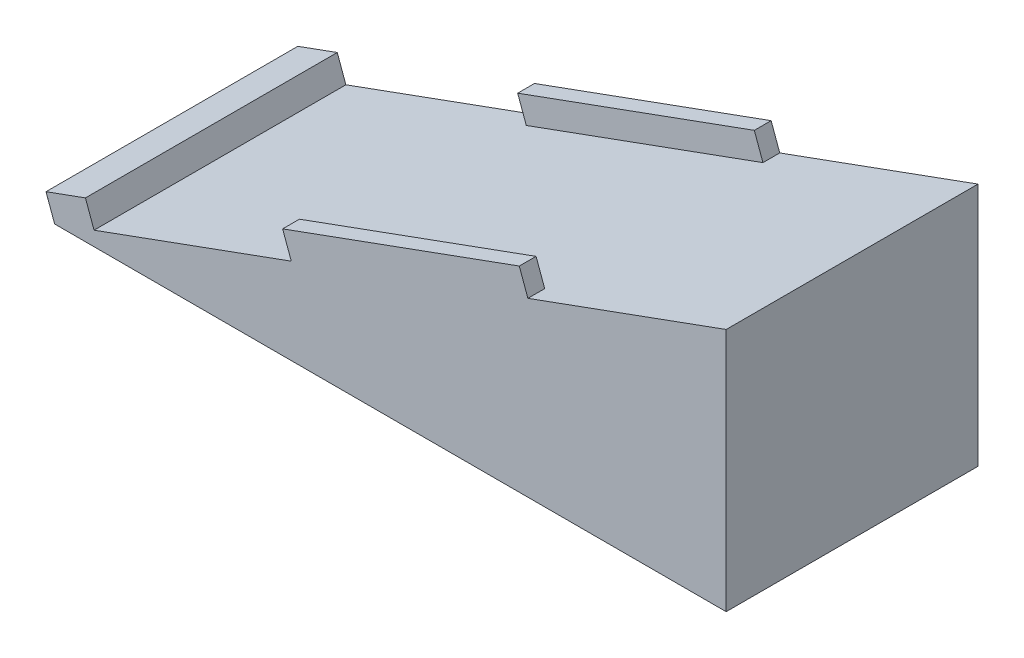
ISO-10303-21;
HEADER;
FILE_DESCRIPTION(('STEP AP214'),'2;1');
FILE_NAME('part.step','',(''),(''),'','','');
FILE_SCHEMA(('AUTOMOTIVE_DESIGN { 1 0 10303 214 1 1 1 1 }'));
ENDSEC;
DATA;
#1=APPLICATION_CONTEXT('core data for automotive mechanical design processes');
#2=APPLICATION_PROTOCOL_DEFINITION('international standard','automotive_design',2000,#1);
#3=PRODUCT_CONTEXT('',#1,'mechanical');
#4=PRODUCT('Part','Part','',(#3));
#5=PRODUCT_RELATED_PRODUCT_CATEGORY('part','',(#4));
#6=PRODUCT_DEFINITION_FORMATION('','',#4);
#7=PRODUCT_DEFINITION_CONTEXT('part definition',#1,'design');
#8=PRODUCT_DEFINITION('design','',#6,#7);
#9=PRODUCT_DEFINITION_SHAPE('','',#8);
#10=(LENGTH_UNIT() NAMED_UNIT(*) SI_UNIT(.MILLI.,.METRE.));
#11=(NAMED_UNIT(*) PLANE_ANGLE_UNIT() SI_UNIT($,.RADIAN.));
#12=(NAMED_UNIT(*) SI_UNIT($,.STERADIAN.) SOLID_ANGLE_UNIT());
#13=UNCERTAINTY_MEASURE_WITH_UNIT(LENGTH_MEASURE(1.E-05),#10,'distance_accuracy_value','');
#14=(GEOMETRIC_REPRESENTATION_CONTEXT(3) GLOBAL_UNCERTAINTY_ASSIGNED_CONTEXT((#13)) GLOBAL_UNIT_ASSIGNED_CONTEXT((#10,
#11,#12)) REPRESENTATION_CONTEXT('',''));
#15=CARTESIAN_POINT('',(0.,0.,0.));
#16=DIRECTION('',(0.,0.,1.));
#17=DIRECTION('',(1.,0.,0.));
#18=AXIS2_PLACEMENT_3D('',#15,#16,#17);
#19=CARTESIAN_POINT('',(0.,0.,30.));
#20=DIRECTION('',(0.342020143325669,-0.939692620785908,0.));
#21=DIRECTION('',(0.939692620785908,0.342020143325669,0.));
#22=AXIS2_PLACEMENT_3D('',#19,#20,#21);
#23=PLANE('',#22);
#24=DIRECTION('',(0.,0.,1.));
#25=VECTOR('',#24,1.);
#26=CARTESIAN_POINT('',(28.1907786235772,10.2606042997701,30.));
#27=LINE('',#26,#25);
#28=CARTESIAN_POINT('',(28.1907786235772,10.2606042997701,28.));
#29=VERTEX_POINT('',#28);
#30=CARTESIAN_POINT('',(28.1907786235772,10.2606042997701,30.));
#31=VERTEX_POINT('',#30);
#32=EDGE_CURVE('E58',#29,#31,#27,.T.);
#33=ORIENTED_EDGE('',*,*,#32,.F.);
#34=DIRECTION('',(-0.939692620785908,-0.342020143325669,0.));
#35=VECTOR('',#34,1.);
#36=CARTESIAN_POINT('',(28.1907786235772,10.2606042997701,28.));
#37=LINE('',#36,#35);
#38=CARTESIAN_POINT('',(56.3815572471545,20.5212085995402,28.));
#39=VERTEX_POINT('',#38);
#40=EDGE_CURVE('E165',#39,#29,#37,.T.);
#41=ORIENTED_EDGE('',*,*,#40,.F.);
#42=DIRECTION('',(0.,0.,-1.));
#43=VECTOR('',#42,1.);
#44=CARTESIAN_POINT('',(56.3815572471545,20.5212085995402,30.));
#45=LINE('',#44,#43);
#46=CARTESIAN_POINT('',(56.3815572471545,20.5212085995402,30.));
#47=VERTEX_POINT('',#46);
#48=EDGE_CURVE('E312',#47,#39,#45,.T.);
#49=ORIENTED_EDGE('',*,*,#48,.F.);
#50=DIRECTION('',(-0.939692620785908,-0.342020143325669,0.));
#51=VECTOR('',#50,1.);
#52=CARTESIAN_POINT('',(0.,0.,30.));
#53=LINE('',#52,#51);
#54=CARTESIAN_POINT('',(80.,29.1176187412963,30.));
#55=VERTEX_POINT('',#54);
#56=EDGE_CURVE('E247',#55,#47,#53,.T.);
#57=ORIENTED_EDGE('',*,*,#56,.F.);
#58=DIRECTION('',(0.,0.,-1.));
#59=VECTOR('',#58,1.);
#60=CARTESIAN_POINT('',(80.,29.1176187412963,30.));
#61=LINE('',#60,#59);
#62=CARTESIAN_POINT('',(80.,29.1176187412963,0.));
#63=VERTEX_POINT('',#62);
#64=EDGE_CURVE('E257',#55,#63,#61,.T.);
#65=ORIENTED_EDGE('',*,*,#64,.T.);
#66=DIRECTION('',(-0.939692620785908,-0.342020143325669,0.));
#67=VECTOR('',#66,1.);
#68=CARTESIAN_POINT('',(0.,0.,0.));
#69=LINE('',#68,#67);
#70=CARTESIAN_POINT('',(56.3815572471545,20.5212085995402,0.));
#71=VERTEX_POINT('',#70);
#72=EDGE_CURVE('E258',#63,#71,#69,.T.);
#73=ORIENTED_EDGE('',*,*,#72,.T.);
#74=DIRECTION('',(0.,0.,-1.));
#75=VECTOR('',#74,1.);
#76=CARTESIAN_POINT('',(56.3815572471545,20.5212085995402,0.));
#77=LINE('',#76,#75);
#78=CARTESIAN_POINT('',(56.3815572471545,20.5212085995402,2.));
#79=VERTEX_POINT('',#78);
#80=EDGE_CURVE('E184',#79,#71,#77,.T.);
#81=ORIENTED_EDGE('',*,*,#80,.F.);
#82=DIRECTION('',(0.939692620785908,0.342020143325669,0.));
#83=VECTOR('',#82,1.);
#84=CARTESIAN_POINT('',(28.1907786235772,10.2606042997701,2.));
#85=LINE('',#84,#83);
#86=CARTESIAN_POINT('',(28.1907786235772,10.2606042997701,2.));
#87=VERTEX_POINT('',#86);
#88=EDGE_CURVE('E66',#87,#79,#85,.T.);
#89=ORIENTED_EDGE('',*,*,#88,.F.);
#90=DIRECTION('',(0.,0.,1.));
#91=VECTOR('',#90,1.);
#92=CARTESIAN_POINT('',(28.1907786235772,10.2606042997701,0.));
#93=LINE('',#92,#91);
#94=CARTESIAN_POINT('',(28.1907786235772,10.2606042997701,0.));
#95=VERTEX_POINT('',#94);
#96=EDGE_CURVE('E169',#95,#87,#93,.T.);
#97=ORIENTED_EDGE('',*,*,#96,.F.);
#98=CARTESIAN_POINT('',(4.69846310392954,1.71010071662835,0.));
#99=VERTEX_POINT('',#98);
#100=EDGE_CURVE('E246',#95,#99,#69,.T.);
#101=ORIENTED_EDGE('',*,*,#100,.T.);
#102=DIRECTION('',(0.,0.,-1.));
#103=VECTOR('',#102,1.);
#104=CARTESIAN_POINT('',(4.69846310392954,1.71010071662835,0.));
#105=LINE('',#104,#103);
#106=CARTESIAN_POINT('',(4.69846310392954,1.71010071662835,30.));
#107=VERTEX_POINT('',#106);
#108=EDGE_CURVE('E213',#107,#99,#105,.T.);
#109=ORIENTED_EDGE('',*,*,#108,.F.);
#110=EDGE_CURVE('E251',#31,#107,#53,.T.);
#111=ORIENTED_EDGE('',*,*,#110,.F.);
#112=EDGE_LOOP('',(#33,#41,#49,#57,#65,#73,#81,#89,#97,#101,#109,#111));
#113=FACE_BOUND('',#112,.T.);
#114=ADVANCED_FACE('F43',(#113),#23,.F.);
#115=CARTESIAN_POINT('',(0.,0.,30.));
#116=DIRECTION('',(0.,1.,0.));
#117=DIRECTION('',(0.,0.,1.));
#118=AXIS2_PLACEMENT_3D('',#115,#116,#117);
#119=PLANE('',#118);
#120=DIRECTION('',(1.,0.,0.));
#121=VECTOR('',#120,1.);
#122=CARTESIAN_POINT('',(0.,0.,0.));
#123=LINE('',#122,#121);
#124=CARTESIAN_POINT('',(0.,0.,0.));
#125=VERTEX_POINT('',#124);
#126=CARTESIAN_POINT('',(80.,0.,0.));
#127=VERTEX_POINT('',#126);
#128=EDGE_CURVE('E261',#125,#127,#123,.T.);
#129=ORIENTED_EDGE('',*,*,#128,.T.);
#130=DIRECTION('',(0.,0.,-1.));
#131=VECTOR('',#130,1.);
#132=CARTESIAN_POINT('',(80.,0.,30.));
#133=LINE('',#132,#131);
#134=CARTESIAN_POINT('',(80.,0.,30.));
#135=VERTEX_POINT('',#134);
#136=EDGE_CURVE('E51',#135,#127,#133,.T.);
#137=ORIENTED_EDGE('',*,*,#136,.F.);
#138=DIRECTION('',(1.,0.,0.));
#139=VECTOR('',#138,1.);
#140=CARTESIAN_POINT('',(0.,0.,30.));
#141=LINE('',#140,#139);
#142=CARTESIAN_POINT('',(0.,0.,30.));
#143=VERTEX_POINT('',#142);
#144=EDGE_CURVE('E250',#143,#135,#141,.T.);
#145=ORIENTED_EDGE('',*,*,#144,.F.);
#146=DIRECTION('',(0.,0.,-1.));
#147=VECTOR('',#146,1.);
#148=CARTESIAN_POINT('',(0.,0.,30.));
#149=LINE('',#148,#147);
#150=EDGE_CURVE('E11',#143,#125,#149,.T.);
#151=ORIENTED_EDGE('',*,*,#150,.T.);
#152=EDGE_LOOP('',(#129,#137,#145,#151));
#153=FACE_BOUND('',#152,.T.);
#154=ADVANCED_FACE('F331',(#153),#119,.F.);
#155=CARTESIAN_POINT('',(80.,29.1176187412963,30.));
#156=DIRECTION('',(-1.,0.,0.));
#157=DIRECTION('',(0.,0.,1.));
#158=AXIS2_PLACEMENT_3D('',#155,#156,#157);
#159=PLANE('',#158);
#160=DIRECTION('',(0.,1.,0.));
#161=VECTOR('',#160,1.);
#162=CARTESIAN_POINT('',(80.,29.1176187412963,0.));
#163=LINE('',#162,#161);
#164=EDGE_CURVE('E264',#127,#63,#163,.T.);
#165=ORIENTED_EDGE('',*,*,#164,.T.);
#166=ORIENTED_EDGE('',*,*,#64,.F.);
#167=DIRECTION('',(0.,1.,0.));
#168=VECTOR('',#167,1.);
#169=CARTESIAN_POINT('',(80.,29.1176187412963,30.));
#170=LINE('',#169,#168);
#171=EDGE_CURVE('E254',#135,#55,#170,.T.);
#172=ORIENTED_EDGE('',*,*,#171,.F.);
#173=ORIENTED_EDGE('',*,*,#136,.T.);
#174=EDGE_LOOP('',(#165,#166,#172,#173));
#175=FACE_BOUND('',#174,.T.);
#176=ADVANCED_FACE('F275',(#175),#159,.F.);
#177=CARTESIAN_POINT('',(0.,0.,30.));
#178=DIRECTION('',(0.,0.,-1.));
#179=DIRECTION('',(-1.,0.,0.));
#180=AXIS2_PLACEMENT_3D('',#177,#178,#179);
#181=PLANE('',#180);
#182=ORIENTED_EDGE('',*,*,#56,.T.);
#183=DIRECTION('',(0.342020143325669,-0.939692620785908,0.));
#184=VECTOR('',#183,1.);
#185=CARTESIAN_POINT('',(55.3554968171775,23.3402864618979,30.));
#186=LINE('',#185,#184);
#187=CARTESIAN_POINT('',(55.3554968171775,23.3402864618979,30.));
#188=VERTEX_POINT('',#187);
#189=EDGE_CURVE('E152',#188,#47,#186,.T.);
#190=ORIENTED_EDGE('',*,*,#189,.F.);
#191=DIRECTION('',(0.939692620785908,0.342020143325669,0.));
#192=VECTOR('',#191,1.);
#193=CARTESIAN_POINT('',(27.1647181936002,13.0796821621278,30.));
#194=LINE('',#193,#192);
#195=CARTESIAN_POINT('',(27.1647181936002,13.0796821621278,30.));
#196=VERTEX_POINT('',#195);
#197=EDGE_CURVE('E146',#196,#188,#194,.T.);
#198=ORIENTED_EDGE('',*,*,#197,.F.);
#199=DIRECTION('',(0.342020143325669,-0.939692620785908,0.));
#200=VECTOR('',#199,1.);
#201=CARTESIAN_POINT('',(27.1647181936002,13.0796821621278,30.));
#202=LINE('',#201,#200);
#203=EDGE_CURVE('E150',#196,#31,#202,.T.);
#204=ORIENTED_EDGE('',*,*,#203,.T.);
#205=ORIENTED_EDGE('',*,*,#110,.T.);
#206=DIRECTION('',(0.342020143325669,-0.939692620785908,0.));
#207=VECTOR('',#206,1.);
#208=CARTESIAN_POINT('',(3.67240267395254,4.52917857898607,30.));
#209=LINE('',#208,#207);
#210=CARTESIAN_POINT('',(3.67240267395254,4.52917857898607,30.));
#211=VERTEX_POINT('',#210);
#212=EDGE_CURVE('E238',#211,#107,#209,.T.);
#213=ORIENTED_EDGE('',*,*,#212,.F.);
#214=DIRECTION('',(0.939692620785908,0.342020143325669,0.));
#215=VECTOR('',#214,1.);
#216=CARTESIAN_POINT('',(-1.02606042997701,2.81907786235772,30.));
#217=LINE('',#216,#215);
#218=CARTESIAN_POINT('',(-1.02606042997701,2.81907786235772,30.));
#219=VERTEX_POINT('',#218);
#220=EDGE_CURVE('E218',#219,#211,#217,.T.);
#221=ORIENTED_EDGE('',*,*,#220,.F.);
#222=DIRECTION('',(0.342020143325669,-0.939692620785908,0.));
#223=VECTOR('',#222,1.);
#224=CARTESIAN_POINT('',(-1.02606042997701,2.81907786235772,30.));
#225=LINE('',#224,#223);
#226=EDGE_CURVE('E242',#219,#143,#225,.T.);
#227=ORIENTED_EDGE('',*,*,#226,.T.);
#228=ORIENTED_EDGE('',*,*,#144,.T.);
#229=ORIENTED_EDGE('',*,*,#171,.T.);
#230=EDGE_LOOP('',(#182,#190,#198,#204,#205,#213,#221,#227,#228,#229));
#231=FACE_BOUND('',#230,.T.);
#232=ADVANCED_FACE('F149',(#231),#181,.F.);
#233=CARTESIAN_POINT('',(0.,0.,0.));
#234=DIRECTION('',(0.,0.,-1.));
#235=DIRECTION('',(-1.,0.,0.));
#236=AXIS2_PLACEMENT_3D('',#233,#234,#235);
#237=PLANE('',#236);
#238=ORIENTED_EDGE('',*,*,#72,.F.);
#239=ORIENTED_EDGE('',*,*,#164,.F.);
#240=ORIENTED_EDGE('',*,*,#128,.F.);
#241=DIRECTION('',(0.342020143325669,-0.939692620785908,0.));
#242=VECTOR('',#241,1.);
#243=CARTESIAN_POINT('',(-1.02606042997701,2.81907786235772,0.));
#244=LINE('',#243,#242);
#245=CARTESIAN_POINT('',(-1.02606042997701,2.81907786235772,0.));
#246=VERTEX_POINT('',#245);
#247=EDGE_CURVE('E227',#246,#125,#244,.T.);
#248=ORIENTED_EDGE('',*,*,#247,.F.);
#249=DIRECTION('',(-0.939692620785908,-0.342020143325669,0.));
#250=VECTOR('',#249,1.);
#251=CARTESIAN_POINT('',(-1.02606042997701,2.81907786235772,0.));
#252=LINE('',#251,#250);
#253=CARTESIAN_POINT('',(3.67240267395253,4.52917857898607,0.));
#254=VERTEX_POINT('',#253);
#255=EDGE_CURVE('E224',#254,#246,#252,.T.);
#256=ORIENTED_EDGE('',*,*,#255,.F.);
#257=DIRECTION('',(0.342020143325669,-0.939692620785908,0.));
#258=VECTOR('',#257,1.);
#259=CARTESIAN_POINT('',(3.67240267395253,4.52917857898607,0.));
#260=LINE('',#259,#258);
#261=EDGE_CURVE('E234',#254,#99,#260,.T.);
#262=ORIENTED_EDGE('',*,*,#261,.T.);
#263=ORIENTED_EDGE('',*,*,#100,.F.);
#264=DIRECTION('',(0.342020143325669,-0.939692620785908,0.));
#265=VECTOR('',#264,1.);
#266=CARTESIAN_POINT('',(27.1647181936002,13.0796821621278,0.));
#267=LINE('',#266,#265);
#268=CARTESIAN_POINT('',(27.1647181936002,13.0796821621278,0.));
#269=VERTEX_POINT('',#268);
#270=EDGE_CURVE('E192',#269,#95,#267,.T.);
#271=ORIENTED_EDGE('',*,*,#270,.F.);
#272=DIRECTION('',(-0.939692620785908,-0.342020143325669,0.));
#273=VECTOR('',#272,1.);
#274=CARTESIAN_POINT('',(27.1647181936002,13.0796821621278,0.));
#275=LINE('',#274,#273);
#276=CARTESIAN_POINT('',(55.3554968171775,23.3402864618979,0.));
#277=VERTEX_POINT('',#276);
#278=EDGE_CURVE('E190',#277,#269,#275,.T.);
#279=ORIENTED_EDGE('',*,*,#278,.F.);
#280=DIRECTION('',(0.342020143325669,-0.939692620785908,0.));
#281=VECTOR('',#280,1.);
#282=CARTESIAN_POINT('',(55.3554968171775,23.3402864618979,0.));
#283=LINE('',#282,#281);
#284=EDGE_CURVE('E202',#277,#71,#283,.T.);
#285=ORIENTED_EDGE('',*,*,#284,.T.);
#286=EDGE_LOOP('',(#238,#239,#240,#248,#256,#262,#263,#271,#279,#285));
#287=FACE_BOUND('',#286,.T.);
#288=ADVANCED_FACE('F280',(#287),#237,.T.);
#289=CARTESIAN_POINT('',(-1.02606042997701,2.81907786235772,0.));
#290=DIRECTION('',(0.939692620785908,0.342020143325669,0.));
#291=DIRECTION('',(-0.342020143325669,0.939692620785908,0.));
#292=AXIS2_PLACEMENT_3D('',#289,#290,#291);
#293=PLANE('',#292);
#294=ORIENTED_EDGE('',*,*,#150,.F.);
#295=ORIENTED_EDGE('',*,*,#226,.F.);
#296=DIRECTION('',(0.,0.,1.));
#297=VECTOR('',#296,1.);
#298=CARTESIAN_POINT('',(-1.02606042997701,2.81907786235772,0.));
#299=LINE('',#298,#297);
#300=EDGE_CURVE('E214',#246,#219,#299,.T.);
#301=ORIENTED_EDGE('',*,*,#300,.F.);
#302=ORIENTED_EDGE('',*,*,#247,.T.);
#303=EDGE_LOOP('',(#294,#295,#301,#302));
#304=FACE_BOUND('',#303,.T.);
#305=ADVANCED_FACE('F333',(#304),#293,.F.);
#306=CARTESIAN_POINT('',(3.67240267395253,4.52917857898607,0.));
#307=DIRECTION('',(-0.939692620785908,-0.342020143325669,0.));
#308=DIRECTION('',(0.342020143325669,-0.939692620785908,0.));
#309=AXIS2_PLACEMENT_3D('',#306,#307,#308);
#310=PLANE('',#309);
#311=ORIENTED_EDGE('',*,*,#108,.T.);
#312=ORIENTED_EDGE('',*,*,#261,.F.);
#313=DIRECTION('',(0.,0.,-1.));
#314=VECTOR('',#313,1.);
#315=CARTESIAN_POINT('',(3.67240267395253,4.52917857898607,0.));
#316=LINE('',#315,#314);
#317=EDGE_CURVE('E221',#211,#254,#316,.T.);
#318=ORIENTED_EDGE('',*,*,#317,.F.);
#319=ORIENTED_EDGE('',*,*,#212,.T.);
#320=EDGE_LOOP('',(#311,#312,#318,#319));
#321=FACE_BOUND('',#320,.T.);
#322=ADVANCED_FACE('F300',(#321),#310,.F.);
#323=CARTESIAN_POINT('',(-1.02606042997701,2.81907786235772,0.));
#324=DIRECTION('',(-0.342020143325669,0.939692620785908,0.));
#325=DIRECTION('',(-0.939692620785908,-0.342020143325669,0.));
#326=AXIS2_PLACEMENT_3D('',#323,#324,#325);
#327=PLANE('',#326);
#328=ORIENTED_EDGE('',*,*,#300,.T.);
#329=ORIENTED_EDGE('',*,*,#220,.T.);
#330=ORIENTED_EDGE('',*,*,#317,.T.);
#331=ORIENTED_EDGE('',*,*,#255,.T.);
#332=EDGE_LOOP('',(#328,#329,#330,#331));
#333=FACE_BOUND('',#332,.T.);
#334=ADVANCED_FACE('F306',(#333),#327,.T.);
#335=CARTESIAN_POINT('',(27.1647181936002,13.0796821621278,0.));
#336=DIRECTION('',(0.939692620785908,0.342020143325669,0.));
#337=DIRECTION('',(-0.342020143325669,0.939692620785908,0.));
#338=AXIS2_PLACEMENT_3D('',#335,#336,#337);
#339=PLANE('',#338);
#340=ORIENTED_EDGE('',*,*,#96,.T.);
#341=DIRECTION('',(0.342020143325669,-0.939692620785908,0.));
#342=VECTOR('',#341,1.);
#343=CARTESIAN_POINT('',(27.1647181936002,13.0796821621278,2.));
#344=LINE('',#343,#342);
#345=CARTESIAN_POINT('',(27.1647181936002,13.0796821621278,2.));
#346=VERTEX_POINT('',#345);
#347=EDGE_CURVE('E210',#346,#87,#344,.T.);
#348=ORIENTED_EDGE('',*,*,#347,.F.);
#349=DIRECTION('',(0.,0.,1.));
#350=VECTOR('',#349,1.);
#351=CARTESIAN_POINT('',(27.1647181936002,13.0796821621278,0.));
#352=LINE('',#351,#350);
#353=EDGE_CURVE('E179',#269,#346,#352,.T.);
#354=ORIENTED_EDGE('',*,*,#353,.F.);
#355=ORIENTED_EDGE('',*,*,#270,.T.);
#356=EDGE_LOOP('',(#340,#348,#354,#355));
#357=FACE_BOUND('',#356,.T.);
#358=ADVANCED_FACE('F294',(#357),#339,.F.);
#359=CARTESIAN_POINT('',(27.1647181936002,13.0796821621278,2.));
#360=DIRECTION('',(0.,0.,-1.));
#361=DIRECTION('',(-1.,0.,0.));
#362=AXIS2_PLACEMENT_3D('',#359,#360,#361);
#363=PLANE('',#362);
#364=ORIENTED_EDGE('',*,*,#88,.T.);
#365=DIRECTION('',(0.342020143325669,-0.939692620785908,0.));
#366=VECTOR('',#365,1.);
#367=CARTESIAN_POINT('',(55.3554968171775,23.3402864618979,2.));
#368=LINE('',#367,#366);
#369=CARTESIAN_POINT('',(55.3554968171775,23.3402864618979,2.));
#370=VERTEX_POINT('',#369);
#371=EDGE_CURVE('E206',#370,#79,#368,.T.);
#372=ORIENTED_EDGE('',*,*,#371,.F.);
#373=DIRECTION('',(0.939692620785908,0.342020143325669,0.));
#374=VECTOR('',#373,1.);
#375=CARTESIAN_POINT('',(27.1647181936002,13.0796821621278,2.));
#376=LINE('',#375,#374);
#377=EDGE_CURVE('E183',#346,#370,#376,.T.);
#378=ORIENTED_EDGE('',*,*,#377,.F.);
#379=ORIENTED_EDGE('',*,*,#347,.T.);
#380=EDGE_LOOP('',(#364,#372,#378,#379));
#381=FACE_BOUND('',#380,.T.);
#382=ADVANCED_FACE('F290',(#381),#363,.F.);
#383=CARTESIAN_POINT('',(55.3554968171775,23.3402864618979,0.));
#384=DIRECTION('',(-0.939692620785908,-0.342020143325669,0.));
#385=DIRECTION('',(0.342020143325669,-0.939692620785908,0.));
#386=AXIS2_PLACEMENT_3D('',#383,#384,#385);
#387=PLANE('',#386);
#388=ORIENTED_EDGE('',*,*,#80,.T.);
#389=ORIENTED_EDGE('',*,*,#284,.F.);
#390=DIRECTION('',(0.,0.,-1.));
#391=VECTOR('',#390,1.);
#392=CARTESIAN_POINT('',(55.3554968171775,23.3402864618979,0.));
#393=LINE('',#392,#391);
#394=EDGE_CURVE('E187',#370,#277,#393,.T.);
#395=ORIENTED_EDGE('',*,*,#394,.F.);
#396=ORIENTED_EDGE('',*,*,#371,.T.);
#397=EDGE_LOOP('',(#388,#389,#395,#396));
#398=FACE_BOUND('',#397,.T.);
#399=ADVANCED_FACE('F286',(#398),#387,.F.);
#400=CARTESIAN_POINT('',(-1.02606042997701,2.81907786235773,0.));
#401=DIRECTION('',(-0.342020143325669,0.939692620785908,0.));
#402=DIRECTION('',(-0.939692620785908,-0.342020143325669,0.));
#403=AXIS2_PLACEMENT_3D('',#400,#401,#402);
#404=PLANE('',#403);
#405=ORIENTED_EDGE('',*,*,#353,.T.);
#406=ORIENTED_EDGE('',*,*,#377,.T.);
#407=ORIENTED_EDGE('',*,*,#394,.T.);
#408=ORIENTED_EDGE('',*,*,#278,.T.);
#409=EDGE_LOOP('',(#405,#406,#407,#408));
#410=FACE_BOUND('',#409,.T.);
#411=ADVANCED_FACE('F409',(#410),#404,.T.);
#412=CARTESIAN_POINT('',(27.1647181936002,13.0796821621278,30.));
#413=DIRECTION('',(0.939692620785908,0.342020143325669,0.));
#414=DIRECTION('',(-0.342020143325669,0.939692620785908,0.));
#415=AXIS2_PLACEMENT_3D('',#412,#413,#414);
#416=PLANE('',#415);
#417=ORIENTED_EDGE('',*,*,#32,.T.);
#418=ORIENTED_EDGE('',*,*,#203,.F.);
#419=DIRECTION('',(0.,0.,1.));
#420=VECTOR('',#419,1.);
#421=CARTESIAN_POINT('',(27.1647181936002,13.0796821621278,30.));
#422=LINE('',#421,#420);
#423=CARTESIAN_POINT('',(27.1647181936002,13.0796821621278,28.));
#424=VERTEX_POINT('',#423);
#425=EDGE_CURVE('E157',#424,#196,#422,.T.);
#426=ORIENTED_EDGE('',*,*,#425,.F.);
#427=DIRECTION('',(0.342020143325669,-0.939692620785908,0.));
#428=VECTOR('',#427,1.);
#429=CARTESIAN_POINT('',(27.1647181936002,13.0796821621278,28.));
#430=LINE('',#429,#428);
#431=EDGE_CURVE('E321',#424,#29,#430,.T.);
#432=ORIENTED_EDGE('',*,*,#431,.T.);
#433=EDGE_LOOP('',(#417,#418,#426,#432));
#434=FACE_BOUND('',#433,.T.);
#435=ADVANCED_FACE('F167',(#434),#416,.F.);
#436=CARTESIAN_POINT('',(55.3554968171775,23.3402864618979,30.));
#437=DIRECTION('',(-0.939692620785908,-0.342020143325669,0.));
#438=DIRECTION('',(0.342020143325669,-0.939692620785908,0.));
#439=AXIS2_PLACEMENT_3D('',#436,#437,#438);
#440=PLANE('',#439);
#441=ORIENTED_EDGE('',*,*,#48,.T.);
#442=DIRECTION('',(0.342020143325669,-0.939692620785908,0.));
#443=VECTOR('',#442,1.);
#444=CARTESIAN_POINT('',(55.3554968171775,23.3402864618979,28.));
#445=LINE('',#444,#443);
#446=CARTESIAN_POINT('',(55.3554968171775,23.3402864618979,28.));
#447=VERTEX_POINT('',#446);
#448=EDGE_CURVE('E175',#447,#39,#445,.T.);
#449=ORIENTED_EDGE('',*,*,#448,.F.);
#450=DIRECTION('',(0.,0.,-1.));
#451=VECTOR('',#450,1.);
#452=CARTESIAN_POINT('',(55.3554968171775,23.3402864618979,30.));
#453=LINE('',#452,#451);
#454=EDGE_CURVE('E156',#188,#447,#453,.T.);
#455=ORIENTED_EDGE('',*,*,#454,.F.);
#456=ORIENTED_EDGE('',*,*,#189,.T.);
#457=EDGE_LOOP('',(#441,#449,#455,#456));
#458=FACE_BOUND('',#457,.T.);
#459=ADVANCED_FACE('F329',(#458),#440,.F.);
#460=CARTESIAN_POINT('',(27.1647181936002,13.0796821621278,28.));
#461=DIRECTION('',(0.,0.,1.));
#462=DIRECTION('',(1.,0.,0.));
#463=AXIS2_PLACEMENT_3D('',#460,#461,#462);
#464=PLANE('',#463);
#465=ORIENTED_EDGE('',*,*,#40,.T.);
#466=ORIENTED_EDGE('',*,*,#431,.F.);
#467=DIRECTION('',(-0.939692620785908,-0.342020143325669,0.));
#468=VECTOR('',#467,1.);
#469=CARTESIAN_POINT('',(27.1647181936002,13.0796821621278,28.));
#470=LINE('',#469,#468);
#471=EDGE_CURVE('E162',#447,#424,#470,.T.);
#472=ORIENTED_EDGE('',*,*,#471,.F.);
#473=ORIENTED_EDGE('',*,*,#448,.T.);
#474=EDGE_LOOP('',(#465,#466,#472,#473));
#475=FACE_BOUND('',#474,.T.);
#476=ADVANCED_FACE('F327',(#475),#464,.F.);
#477=CARTESIAN_POINT('',(-1.02606042997701,2.81907786235773,0.));
#478=DIRECTION('',(0.342020143325669,-0.939692620785908,0.));
#479=DIRECTION('',(0.939692620785908,0.342020143325669,0.));
#480=AXIS2_PLACEMENT_3D('',#477,#478,#479);
#481=PLANE('',#480);
#482=ORIENTED_EDGE('',*,*,#425,.T.);
#483=ORIENTED_EDGE('',*,*,#197,.T.);
#484=ORIENTED_EDGE('',*,*,#454,.T.);
#485=ORIENTED_EDGE('',*,*,#471,.T.);
#486=EDGE_LOOP('',(#482,#483,#484,#485));
#487=FACE_BOUND('',#486,.T.);
#488=ADVANCED_FACE('F160',(#487),#481,.F.);
#489=CLOSED_SHELL('',(#114,#154,#176,#232,#288,#305,#322,#334,#358,#382,#399,#411,#435,#459,
#476,#488));
#490=MANIFOLD_SOLID_BREP('B2',#489);
#491=ADVANCED_BREP_SHAPE_REPRESENTATION('',(#18,#490),#14);
#492=SHAPE_DEFINITION_REPRESENTATION(#9,#491);
ENDSEC;
END-ISO-10303-21;
